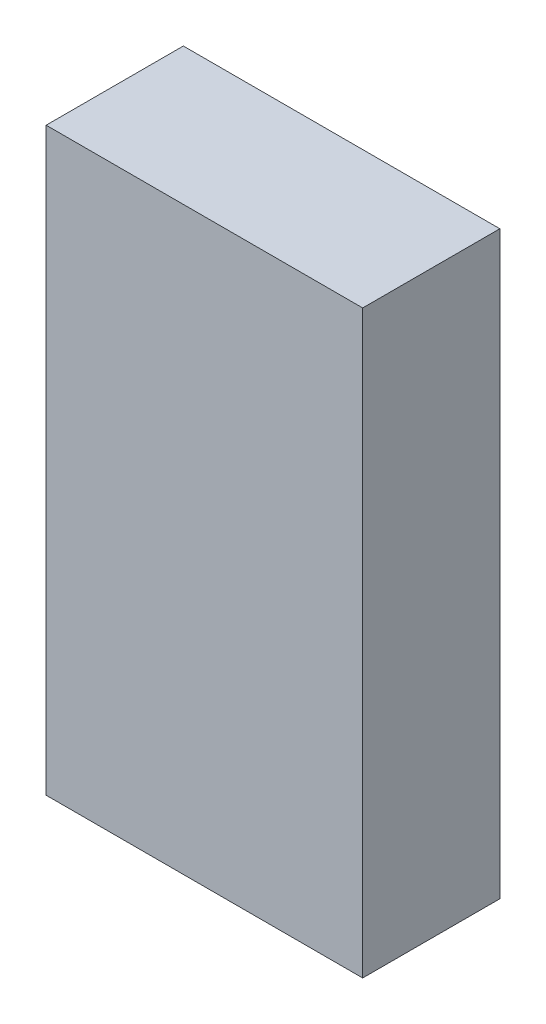
ISO-10303-21;
HEADER;
FILE_DESCRIPTION(('STEP AP214'),'2;1');
FILE_NAME('part.step','',(''),(''),'','','');
FILE_SCHEMA(('AUTOMOTIVE_DESIGN { 1 0 10303 214 1 1 1 1 }'));
ENDSEC;
DATA;
#1=APPLICATION_CONTEXT('core data for automotive mechanical design processes');
#2=APPLICATION_PROTOCOL_DEFINITION('international standard','automotive_design',2000,#1);
#3=PRODUCT_CONTEXT('',#1,'mechanical');
#4=PRODUCT('Part','Part','',(#3));
#5=PRODUCT_RELATED_PRODUCT_CATEGORY('part','',(#4));
#6=PRODUCT_DEFINITION_FORMATION('','',#4);
#7=PRODUCT_DEFINITION_CONTEXT('part definition',#1,'design');
#8=PRODUCT_DEFINITION('design','',#6,#7);
#9=PRODUCT_DEFINITION_SHAPE('','',#8);
#10=(LENGTH_UNIT() NAMED_UNIT(*) SI_UNIT(.MILLI.,.METRE.));
#11=(NAMED_UNIT(*) PLANE_ANGLE_UNIT() SI_UNIT($,.RADIAN.));
#12=(NAMED_UNIT(*) SI_UNIT($,.STERADIAN.) SOLID_ANGLE_UNIT());
#13=UNCERTAINTY_MEASURE_WITH_UNIT(LENGTH_MEASURE(1.E-05),#10,'distance_accuracy_value','');
#14=(GEOMETRIC_REPRESENTATION_CONTEXT(3) GLOBAL_UNCERTAINTY_ASSIGNED_CONTEXT((#13)) GLOBAL_UNIT_ASSIGNED_CONTEXT((#10,
#11,#12)) REPRESENTATION_CONTEXT('',''));
#15=CARTESIAN_POINT('',(0.,0.,0.));
#16=DIRECTION('',(0.,0.,1.));
#17=DIRECTION('',(1.,0.,0.));
#18=AXIS2_PLACEMENT_3D('',#15,#16,#17);
#19=CARTESIAN_POINT('',(0.,0.,26.));
#20=DIRECTION('',(1.,0.,0.));
#21=DIRECTION('',(0.,0.,-1.));
#22=AXIS2_PLACEMENT_3D('',#19,#20,#21);
#23=PLANE('',#22);
#24=DIRECTION('',(0.,-1.,0.));
#25=VECTOR('',#24,1.);
#26=CARTESIAN_POINT('',(0.,0.,0.));
#27=LINE('',#26,#25);
#28=CARTESIAN_POINT('',(0.,110.,0.));
#29=VERTEX_POINT('',#28);
#30=CARTESIAN_POINT('',(0.,0.,0.));
#31=VERTEX_POINT('',#30);
#32=EDGE_CURVE('E97',#29,#31,#27,.T.);
#33=ORIENTED_EDGE('',*,*,#32,.T.);
#34=DIRECTION('',(0.,0.,-1.));
#35=VECTOR('',#34,1.);
#36=CARTESIAN_POINT('',(0.,0.,26.));
#37=LINE('',#36,#35);
#38=CARTESIAN_POINT('',(0.,0.,26.));
#39=VERTEX_POINT('',#38);
#40=EDGE_CURVE('E11',#39,#31,#37,.T.);
#41=ORIENTED_EDGE('',*,*,#40,.F.);
#42=DIRECTION('',(0.,-1.,0.));
#43=VECTOR('',#42,1.);
#44=CARTESIAN_POINT('',(0.,0.,26.));
#45=LINE('',#44,#43);
#46=CARTESIAN_POINT('',(0.,110.,26.));
#47=VERTEX_POINT('',#46);
#48=EDGE_CURVE('E85',#47,#39,#45,.T.);
#49=ORIENTED_EDGE('',*,*,#48,.F.);
#50=DIRECTION('',(0.,0.,-1.));
#51=VECTOR('',#50,1.);
#52=CARTESIAN_POINT('',(0.,110.,26.));
#53=LINE('',#52,#51);
#54=EDGE_CURVE('E93',#47,#29,#53,.T.);
#55=ORIENTED_EDGE('',*,*,#54,.T.);
#56=EDGE_LOOP('',(#33,#41,#49,#55));
#57=FACE_BOUND('',#56,.T.);
#58=ADVANCED_FACE('F34',(#57),#23,.F.);
#59=CARTESIAN_POINT('',(0.,0.,26.));
#60=DIRECTION('',(0.,1.,0.));
#61=DIRECTION('',(0.,0.,1.));
#62=AXIS2_PLACEMENT_3D('',#59,#60,#61);
#63=PLANE('',#62);
#64=DIRECTION('',(1.,0.,0.));
#65=VECTOR('',#64,1.);
#66=CARTESIAN_POINT('',(0.,0.,0.));
#67=LINE('',#66,#65);
#68=CARTESIAN_POINT('',(60.,0.,0.));
#69=VERTEX_POINT('',#68);
#70=EDGE_CURVE('E89',#31,#69,#67,.T.);
#71=ORIENTED_EDGE('',*,*,#70,.T.);
#72=DIRECTION('',(0.,0.,-1.));
#73=VECTOR('',#72,1.);
#74=CARTESIAN_POINT('',(60.,0.,26.));
#75=LINE('',#74,#73);
#76=CARTESIAN_POINT('',(60.,0.,26.));
#77=VERTEX_POINT('',#76);
#78=EDGE_CURVE('E42',#77,#69,#75,.T.);
#79=ORIENTED_EDGE('',*,*,#78,.F.);
#80=DIRECTION('',(1.,0.,0.));
#81=VECTOR('',#80,1.);
#82=CARTESIAN_POINT('',(0.,0.,26.));
#83=LINE('',#82,#81);
#84=EDGE_CURVE('E80',#39,#77,#83,.T.);
#85=ORIENTED_EDGE('',*,*,#84,.F.);
#86=ORIENTED_EDGE('',*,*,#40,.T.);
#87=EDGE_LOOP('',(#71,#79,#85,#86));
#88=FACE_BOUND('',#87,.T.);
#89=ADVANCED_FACE('F88',(#88),#63,.F.);
#90=CARTESIAN_POINT('',(60.,0.,26.));
#91=DIRECTION('',(-1.,0.,0.));
#92=DIRECTION('',(0.,0.,1.));
#93=AXIS2_PLACEMENT_3D('',#90,#91,#92);
#94=PLANE('',#93);
#95=DIRECTION('',(0.,1.,0.));
#96=VECTOR('',#95,1.);
#97=CARTESIAN_POINT('',(60.,0.,0.));
#98=LINE('',#97,#96);
#99=CARTESIAN_POINT('',(60.,110.,0.));
#100=VERTEX_POINT('',#99);
#101=EDGE_CURVE('E67',#69,#100,#98,.T.);
#102=ORIENTED_EDGE('',*,*,#101,.T.);
#103=DIRECTION('',(0.,0.,-1.));
#104=VECTOR('',#103,1.);
#105=CARTESIAN_POINT('',(60.,110.,26.));
#106=LINE('',#105,#104);
#107=CARTESIAN_POINT('',(60.,110.,26.));
#108=VERTEX_POINT('',#107);
#109=EDGE_CURVE('E90',#108,#100,#106,.T.);
#110=ORIENTED_EDGE('',*,*,#109,.F.);
#111=DIRECTION('',(0.,1.,0.));
#112=VECTOR('',#111,1.);
#113=CARTESIAN_POINT('',(60.,0.,26.));
#114=LINE('',#113,#112);
#115=EDGE_CURVE('E83',#77,#108,#114,.T.);
#116=ORIENTED_EDGE('',*,*,#115,.F.);
#117=ORIENTED_EDGE('',*,*,#78,.T.);
#118=EDGE_LOOP('',(#102,#110,#116,#117));
#119=FACE_BOUND('',#118,.T.);
#120=ADVANCED_FACE('F91',(#119),#94,.F.);
#121=CARTESIAN_POINT('',(0.,110.,26.));
#122=DIRECTION('',(0.,-1.,0.));
#123=DIRECTION('',(0.,0.,-1.));
#124=AXIS2_PLACEMENT_3D('',#121,#122,#123);
#125=PLANE('',#124);
#126=DIRECTION('',(-1.,0.,0.));
#127=VECTOR('',#126,1.);
#128=CARTESIAN_POINT('',(0.,110.,0.));
#129=LINE('',#128,#127);
#130=EDGE_CURVE('E73',#100,#29,#129,.T.);
#131=ORIENTED_EDGE('',*,*,#130,.T.);
#132=ORIENTED_EDGE('',*,*,#54,.F.);
#133=DIRECTION('',(-1.,0.,0.));
#134=VECTOR('',#133,1.);
#135=CARTESIAN_POINT('',(0.,110.,26.));
#136=LINE('',#135,#134);
#137=EDGE_CURVE('E50',#108,#47,#136,.T.);
#138=ORIENTED_EDGE('',*,*,#137,.F.);
#139=ORIENTED_EDGE('',*,*,#109,.T.);
#140=EDGE_LOOP('',(#131,#132,#138,#139));
#141=FACE_BOUND('',#140,.T.);
#142=ADVANCED_FACE('F104',(#141),#125,.F.);
#143=CARTESIAN_POINT('',(0.,0.,26.));
#144=DIRECTION('',(0.,0.,-1.));
#145=DIRECTION('',(-1.,0.,0.));
#146=AXIS2_PLACEMENT_3D('',#143,#144,#145);
#147=PLANE('',#146);
#148=ORIENTED_EDGE('',*,*,#48,.T.);
#149=ORIENTED_EDGE('',*,*,#84,.T.);
#150=ORIENTED_EDGE('',*,*,#115,.T.);
#151=ORIENTED_EDGE('',*,*,#137,.T.);
#152=EDGE_LOOP('',(#148,#149,#150,#151));
#153=FACE_BOUND('',#152,.T.);
#154=ADVANCED_FACE('F81',(#153),#147,.F.);
#155=CARTESIAN_POINT('',(0.,0.,0.));
#156=DIRECTION('',(0.,0.,-1.));
#157=DIRECTION('',(-1.,0.,0.));
#158=AXIS2_PLACEMENT_3D('',#155,#156,#157);
#159=PLANE('',#158);
#160=ORIENTED_EDGE('',*,*,#32,.F.);
#161=ORIENTED_EDGE('',*,*,#130,.F.);
#162=ORIENTED_EDGE('',*,*,#101,.F.);
#163=ORIENTED_EDGE('',*,*,#70,.F.);
#164=EDGE_LOOP('',(#160,#161,#162,#163));
#165=FACE_BOUND('',#164,.T.);
#166=ADVANCED_FACE('F107',(#165),#159,.T.);
#167=CLOSED_SHELL('',(#58,#89,#120,#142,#154,#166));
#168=MANIFOLD_SOLID_BREP('B2',#167);
#169=ADVANCED_BREP_SHAPE_REPRESENTATION('',(#18,#168),#14);
#170=SHAPE_DEFINITION_REPRESENTATION(#9,#169);
ENDSEC;
END-ISO-10303-21;
